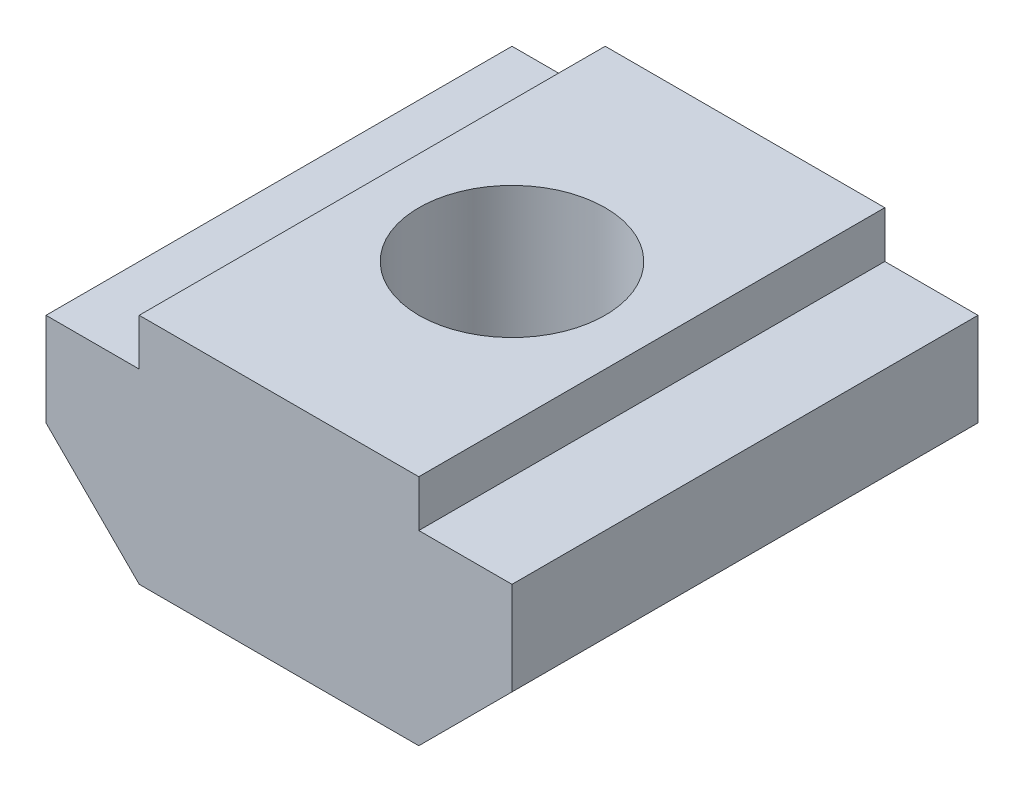
ISO-10303-21;
HEADER;
FILE_DESCRIPTION(('STEP AP214'),'2;1');
FILE_NAME('part.step','',(''),(''),'','','');
FILE_SCHEMA(('AUTOMOTIVE_DESIGN { 1 0 10303 214 1 1 1 1 }'));
ENDSEC;
DATA;
#1=APPLICATION_CONTEXT('core data for automotive mechanical design processes');
#2=APPLICATION_PROTOCOL_DEFINITION('international standard','automotive_design',2000,#1);
#3=PRODUCT_CONTEXT('',#1,'mechanical');
#4=PRODUCT('Part','Part','',(#3));
#5=PRODUCT_RELATED_PRODUCT_CATEGORY('part','',(#4));
#6=PRODUCT_DEFINITION_FORMATION('','',#4);
#7=PRODUCT_DEFINITION_CONTEXT('part definition',#1,'design');
#8=PRODUCT_DEFINITION('design','',#6,#7);
#9=PRODUCT_DEFINITION_SHAPE('','',#8);
#10=(LENGTH_UNIT() NAMED_UNIT(*) SI_UNIT(.MILLI.,.METRE.));
#11=(NAMED_UNIT(*) PLANE_ANGLE_UNIT() SI_UNIT($,.RADIAN.));
#12=(NAMED_UNIT(*) SI_UNIT($,.STERADIAN.) SOLID_ANGLE_UNIT());
#13=UNCERTAINTY_MEASURE_WITH_UNIT(LENGTH_MEASURE(1.E-05),#10,'distance_accuracy_value','');
#14=(GEOMETRIC_REPRESENTATION_CONTEXT(3) GLOBAL_UNCERTAINTY_ASSIGNED_CONTEXT((#13)) GLOBAL_UNIT_ASSIGNED_CONTEXT((#10,
#11,#12)) REPRESENTATION_CONTEXT('',''));
#15=CARTESIAN_POINT('',(0.,0.,0.));
#16=DIRECTION('',(0.,0.,1.));
#17=DIRECTION('',(1.,0.,0.));
#18=AXIS2_PLACEMENT_3D('',#15,#16,#17);
#19=CARTESIAN_POINT('',(3.,0.,10.));
#20=DIRECTION('',(-1.,0.,0.));
#21=DIRECTION('',(0.,0.,1.));
#22=AXIS2_PLACEMENT_3D('',#19,#20,#21);
#23=PLANE('',#22);
#24=DIRECTION('',(0.,1.,0.));
#25=VECTOR('',#24,1.);
#26=CARTESIAN_POINT('',(3.,0.,0.));
#27=LINE('',#26,#25);
#28=CARTESIAN_POINT('',(3.,-0.999999999999999,0.));
#29=VERTEX_POINT('',#28);
#30=CARTESIAN_POINT('',(3.,0.,0.));
#31=VERTEX_POINT('',#30);
#32=EDGE_CURVE('E136',#29,#31,#27,.T.);
#33=ORIENTED_EDGE('',*,*,#32,.T.);
#34=DIRECTION('',(0.,0.,-1.));
#35=VECTOR('',#34,1.);
#36=CARTESIAN_POINT('',(3.,0.,10.));
#37=LINE('',#36,#35);
#38=CARTESIAN_POINT('',(3.,0.,10.));
#39=VERTEX_POINT('',#38);
#40=EDGE_CURVE('E118',#39,#31,#37,.T.);
#41=ORIENTED_EDGE('',*,*,#40,.F.);
#42=DIRECTION('',(0.,1.,0.));
#43=VECTOR('',#42,1.);
#44=CARTESIAN_POINT('',(3.,0.,10.));
#45=LINE('',#44,#43);
#46=CARTESIAN_POINT('',(3.,-0.999999999999999,10.));
#47=VERTEX_POINT('',#46);
#48=EDGE_CURVE('E124',#47,#39,#45,.T.);
#49=ORIENTED_EDGE('',*,*,#48,.F.);
#50=DIRECTION('',(0.,0.,-1.));
#51=VECTOR('',#50,1.);
#52=CARTESIAN_POINT('',(3.,-0.999999999999999,10.));
#53=LINE('',#52,#51);
#54=EDGE_CURVE('E186',#47,#29,#53,.T.);
#55=ORIENTED_EDGE('',*,*,#54,.T.);
#56=EDGE_LOOP('',(#33,#41,#49,#55));
#57=FACE_BOUND('',#56,.T.);
#58=ADVANCED_FACE('F34',(#57),#23,.F.);
#59=CARTESIAN_POINT('',(-3.,0.,10.));
#60=DIRECTION('',(0.,-1.,0.));
#61=DIRECTION('',(0.,0.,-1.));
#62=AXIS2_PLACEMENT_3D('',#59,#60,#61);
#63=PLANE('',#62);
#64=CARTESIAN_POINT('',(0.,0.,5.));
#65=DIRECTION('',(0.,1.,0.));
#66=DIRECTION('',(0.,0.,1.));
#67=AXIS2_PLACEMENT_3D('',#64,#65,#66);
#68=CIRCLE('',#67,2.);
#69=CARTESIAN_POINT('',(0.,0.,7.));
#70=VERTEX_POINT('',#69);
#71=EDGE_CURVE('E211',#70,#70,#68,.T.);
#72=ORIENTED_EDGE('',*,*,#71,.F.);
#73=EDGE_LOOP('',(#72));
#74=FACE_BOUND('',#73,.T.);
#75=DIRECTION('',(-1.,0.,0.));
#76=VECTOR('',#75,1.);
#77=CARTESIAN_POINT('',(-3.,0.,0.));
#78=LINE('',#77,#76);
#79=CARTESIAN_POINT('',(-3.,0.,0.));
#80=VERTEX_POINT('',#79);
#81=EDGE_CURVE('E199',#31,#80,#78,.T.);
#82=ORIENTED_EDGE('',*,*,#81,.T.);
#83=DIRECTION('',(0.,0.,-1.));
#84=VECTOR('',#83,1.);
#85=CARTESIAN_POINT('',(-3.,0.,10.));
#86=LINE('',#85,#84);
#87=CARTESIAN_POINT('',(-3.,0.,10.));
#88=VERTEX_POINT('',#87);
#89=EDGE_CURVE('E121',#88,#80,#86,.T.);
#90=ORIENTED_EDGE('',*,*,#89,.F.);
#91=DIRECTION('',(-1.,0.,0.));
#92=VECTOR('',#91,1.);
#93=CARTESIAN_POINT('',(-3.,0.,10.));
#94=LINE('',#93,#92);
#95=EDGE_CURVE('E114',#39,#88,#94,.T.);
#96=ORIENTED_EDGE('',*,*,#95,.F.);
#97=ORIENTED_EDGE('',*,*,#40,.T.);
#98=EDGE_LOOP('',(#82,#90,#96,#97));
#99=FACE_BOUND('',#98,.T.);
#100=ADVANCED_FACE('F116',(#74,#99),#63,.F.);
#101=CARTESIAN_POINT('',(-3.,0.,10.));
#102=DIRECTION('',(1.,0.,0.));
#103=DIRECTION('',(0.,0.,-1.));
#104=AXIS2_PLACEMENT_3D('',#101,#102,#103);
#105=PLANE('',#104);
#106=DIRECTION('',(0.,-1.,0.));
#107=VECTOR('',#106,1.);
#108=CARTESIAN_POINT('',(-3.,0.,0.));
#109=LINE('',#108,#107);
#110=CARTESIAN_POINT('',(-3.,-1.,0.));
#111=VERTEX_POINT('',#110);
#112=EDGE_CURVE('E180',#80,#111,#109,.T.);
#113=ORIENTED_EDGE('',*,*,#112,.T.);
#114=DIRECTION('',(0.,0.,-1.));
#115=VECTOR('',#114,1.);
#116=CARTESIAN_POINT('',(-3.,-1.,10.));
#117=LINE('',#116,#115);
#118=CARTESIAN_POINT('',(-3.,-1.,10.));
#119=VERTEX_POINT('',#118);
#120=EDGE_CURVE('E141',#119,#111,#117,.T.);
#121=ORIENTED_EDGE('',*,*,#120,.F.);
#122=DIRECTION('',(0.,-1.,0.));
#123=VECTOR('',#122,1.);
#124=CARTESIAN_POINT('',(-3.,0.,10.));
#125=LINE('',#124,#123);
#126=EDGE_CURVE('E123',#88,#119,#125,.T.);
#127=ORIENTED_EDGE('',*,*,#126,.F.);
#128=ORIENTED_EDGE('',*,*,#89,.T.);
#129=EDGE_LOOP('',(#113,#121,#127,#128));
#130=FACE_BOUND('',#129,.T.);
#131=ADVANCED_FACE('F218',(#130),#105,.F.);
#132=CARTESIAN_POINT('',(-5.,-1.,10.));
#133=DIRECTION('',(0.,-1.,0.));
#134=DIRECTION('',(1.,0.,0.));
#135=AXIS2_PLACEMENT_3D('',#132,#133,#134);
#136=PLANE('',#135);
#137=DIRECTION('',(-1.,0.,0.));
#138=VECTOR('',#137,1.);
#139=CARTESIAN_POINT('',(-5.,-1.,0.));
#140=LINE('',#139,#138);
#141=CARTESIAN_POINT('',(-5.,-1.,0.));
#142=VERTEX_POINT('',#141);
#143=EDGE_CURVE('E176',#111,#142,#140,.T.);
#144=ORIENTED_EDGE('',*,*,#143,.T.);
#145=DIRECTION('',(0.,0.,-1.));
#146=VECTOR('',#145,1.);
#147=CARTESIAN_POINT('',(-5.,-1.,10.));
#148=LINE('',#147,#146);
#149=CARTESIAN_POINT('',(-5.,-1.,10.));
#150=VERTEX_POINT('',#149);
#151=EDGE_CURVE('E175',#150,#142,#148,.T.);
#152=ORIENTED_EDGE('',*,*,#151,.F.);
#153=DIRECTION('',(-1.,0.,0.));
#154=VECTOR('',#153,1.);
#155=CARTESIAN_POINT('',(-5.,-1.,10.));
#156=LINE('',#155,#154);
#157=EDGE_CURVE('E196',#119,#150,#156,.T.);
#158=ORIENTED_EDGE('',*,*,#157,.F.);
#159=ORIENTED_EDGE('',*,*,#120,.T.);
#160=EDGE_LOOP('',(#144,#152,#158,#159));
#161=FACE_BOUND('',#160,.T.);
#162=ADVANCED_FACE('F195',(#161),#136,.F.);
#163=CARTESIAN_POINT('',(-5.,-1.,10.));
#164=DIRECTION('',(1.,0.,0.));
#165=DIRECTION('',(0.,1.,0.));
#166=AXIS2_PLACEMENT_3D('',#163,#164,#165);
#167=PLANE('',#166);
#168=DIRECTION('',(0.,-1.,0.));
#169=VECTOR('',#168,1.);
#170=CARTESIAN_POINT('',(-5.,-1.,0.));
#171=LINE('',#170,#169);
#172=CARTESIAN_POINT('',(-5.,-2.99999999999999,0.));
#173=VERTEX_POINT('',#172);
#174=EDGE_CURVE('E170',#142,#173,#171,.T.);
#175=ORIENTED_EDGE('',*,*,#174,.T.);
#176=DIRECTION('',(0.,0.,1.));
#177=VECTOR('',#176,1.);
#178=CARTESIAN_POINT('',(-5.,-2.99999999999999,10.));
#179=LINE('',#178,#177);
#180=CARTESIAN_POINT('',(-5.,-2.99999999999999,10.));
#181=VERTEX_POINT('',#180);
#182=EDGE_CURVE('E57',#173,#181,#179,.T.);
#183=ORIENTED_EDGE('',*,*,#182,.T.);
#184=DIRECTION('',(0.,-1.,0.));
#185=VECTOR('',#184,1.);
#186=CARTESIAN_POINT('',(-5.,-1.,10.));
#187=LINE('',#186,#185);
#188=EDGE_CURVE('E155',#150,#181,#187,.T.);
#189=ORIENTED_EDGE('',*,*,#188,.F.);
#190=ORIENTED_EDGE('',*,*,#151,.T.);
#191=EDGE_LOOP('',(#175,#183,#189,#190));
#192=FACE_BOUND('',#191,.T.);
#193=ADVANCED_FACE('F173',(#192),#167,.F.);
#194=CARTESIAN_POINT('',(-5.,-5.,10.));
#195=DIRECTION('',(0.,1.,0.));
#196=DIRECTION('',(0.,0.,1.));
#197=AXIS2_PLACEMENT_3D('',#194,#195,#196);
#198=PLANE('',#197);
#199=CARTESIAN_POINT('',(0.,-5.,5.));
#200=DIRECTION('',(0.,1.,0.));
#201=DIRECTION('',(0.,0.,1.));
#202=AXIS2_PLACEMENT_3D('',#199,#200,#201);
#203=CIRCLE('',#202,2.);
#204=CARTESIAN_POINT('',(0.,-5.,7.));
#205=VERTEX_POINT('',#204);
#206=EDGE_CURVE('E203',#205,#205,#203,.F.);
#207=ORIENTED_EDGE('',*,*,#206,.F.);
#208=EDGE_LOOP('',(#207));
#209=FACE_BOUND('',#208,.T.);
#210=DIRECTION('',(1.,0.,0.));
#211=VECTOR('',#210,1.);
#212=CARTESIAN_POINT('',(-5.,-5.,10.));
#213=LINE('',#212,#211);
#214=CARTESIAN_POINT('',(-3.,-5.,10.));
#215=VERTEX_POINT('',#214);
#216=CARTESIAN_POINT('',(2.99999999999999,-5.,10.));
#217=VERTEX_POINT('',#216);
#218=EDGE_CURVE('E154',#215,#217,#213,.T.);
#219=ORIENTED_EDGE('',*,*,#218,.F.);
#220=DIRECTION('',(0.,0.,-1.));
#221=VECTOR('',#220,1.);
#222=CARTESIAN_POINT('',(-3.,-5.,10.));
#223=LINE('',#222,#221);
#224=CARTESIAN_POINT('',(-3.,-5.,0.));
#225=VERTEX_POINT('',#224);
#226=EDGE_CURVE('E139',#215,#225,#223,.T.);
#227=ORIENTED_EDGE('',*,*,#226,.T.);
#228=DIRECTION('',(1.,0.,0.));
#229=VECTOR('',#228,1.);
#230=CARTESIAN_POINT('',(-5.,-5.,0.));
#231=LINE('',#230,#229);
#232=CARTESIAN_POINT('',(2.99999999999999,-5.,0.));
#233=VERTEX_POINT('',#232);
#234=EDGE_CURVE('E171',#225,#233,#231,.T.);
#235=ORIENTED_EDGE('',*,*,#234,.T.);
#236=DIRECTION('',(0.,0.,1.));
#237=VECTOR('',#236,1.);
#238=CARTESIAN_POINT('',(2.99999999999999,-5.,10.));
#239=LINE('',#238,#237);
#240=EDGE_CURVE('E137',#233,#217,#239,.T.);
#241=ORIENTED_EDGE('',*,*,#240,.T.);
#242=EDGE_LOOP('',(#219,#227,#235,#241));
#243=FACE_BOUND('',#242,.T.);
#244=ADVANCED_FACE('F159',(#209,#243),#198,.F.);
#245=CARTESIAN_POINT('',(5.,-5.,10.));
#246=DIRECTION('',(-1.,0.,0.));
#247=DIRECTION('',(0.,-1.,0.));
#248=AXIS2_PLACEMENT_3D('',#245,#246,#247);
#249=PLANE('',#248);
#250=DIRECTION('',(0.,1.,0.));
#251=VECTOR('',#250,1.);
#252=CARTESIAN_POINT('',(5.,-5.,10.));
#253=LINE('',#252,#251);
#254=CARTESIAN_POINT('',(5.,-3.,10.));
#255=VERTEX_POINT('',#254);
#256=CARTESIAN_POINT('',(5.,-0.999999999999998,10.));
#257=VERTEX_POINT('',#256);
#258=EDGE_CURVE('E163',#255,#257,#253,.T.);
#259=ORIENTED_EDGE('',*,*,#258,.F.);
#260=DIRECTION('',(0.,0.,-1.));
#261=VECTOR('',#260,1.);
#262=CARTESIAN_POINT('',(5.,-3.,10.));
#263=LINE('',#262,#261);
#264=CARTESIAN_POINT('',(5.,-3.,0.));
#265=VERTEX_POINT('',#264);
#266=EDGE_CURVE('E11',#255,#265,#263,.T.);
#267=ORIENTED_EDGE('',*,*,#266,.T.);
#268=DIRECTION('',(0.,1.,0.));
#269=VECTOR('',#268,1.);
#270=CARTESIAN_POINT('',(5.,-5.,0.));
#271=LINE('',#270,#269);
#272=CARTESIAN_POINT('',(5.,-0.999999999999998,0.));
#273=VERTEX_POINT('',#272);
#274=EDGE_CURVE('E178',#265,#273,#271,.T.);
#275=ORIENTED_EDGE('',*,*,#274,.T.);
#276=DIRECTION('',(0.,0.,-1.));
#277=VECTOR('',#276,1.);
#278=CARTESIAN_POINT('',(5.,-0.999999999999998,10.));
#279=LINE('',#278,#277);
#280=EDGE_CURVE('E188',#257,#273,#279,.T.);
#281=ORIENTED_EDGE('',*,*,#280,.F.);
#282=EDGE_LOOP('',(#259,#267,#275,#281));
#283=FACE_BOUND('',#282,.T.);
#284=ADVANCED_FACE('F243',(#283),#249,.F.);
#285=CARTESIAN_POINT('',(3.,-0.999999999999999,10.));
#286=DIRECTION('',(0.,-1.,0.));
#287=DIRECTION('',(1.,0.,0.));
#288=AXIS2_PLACEMENT_3D('',#285,#286,#287);
#289=PLANE('',#288);
#290=DIRECTION('',(-1.,0.,0.));
#291=VECTOR('',#290,1.);
#292=CARTESIAN_POINT('',(3.,-0.999999999999999,0.));
#293=LINE('',#292,#291);
#294=EDGE_CURVE('E133',#273,#29,#293,.T.);
#295=ORIENTED_EDGE('',*,*,#294,.T.);
#296=ORIENTED_EDGE('',*,*,#54,.F.);
#297=DIRECTION('',(-1.,0.,0.));
#298=VECTOR('',#297,1.);
#299=CARTESIAN_POINT('',(3.,-0.999999999999999,10.));
#300=LINE('',#299,#298);
#301=EDGE_CURVE('E129',#257,#47,#300,.T.);
#302=ORIENTED_EDGE('',*,*,#301,.F.);
#303=ORIENTED_EDGE('',*,*,#280,.T.);
#304=EDGE_LOOP('',(#295,#296,#302,#303));
#305=FACE_BOUND('',#304,.T.);
#306=ADVANCED_FACE('F237',(#305),#289,.F.);
#307=CARTESIAN_POINT('',(0.,0.,10.));
#308=DIRECTION('',(0.,0.,1.));
#309=DIRECTION('',(1.,0.,0.));
#310=AXIS2_PLACEMENT_3D('',#307,#308,#309);
#311=PLANE('',#310);
#312=ORIENTED_EDGE('',*,*,#188,.T.);
#313=DIRECTION('',(-0.707106781186546,0.707106781186549,0.));
#314=VECTOR('',#313,1.);
#315=CARTESIAN_POINT('',(-4.,-3.99999999999999,10.));
#316=LINE('',#315,#314);
#317=EDGE_CURVE('E42',#181,#215,#316,.F.);
#318=ORIENTED_EDGE('',*,*,#317,.T.);
#319=ORIENTED_EDGE('',*,*,#218,.T.);
#320=DIRECTION('',(-0.707106781186549,-0.707106781186546,0.));
#321=VECTOR('',#320,1.);
#322=CARTESIAN_POINT('',(3.99999999999999,-4.,10.));
#323=LINE('',#322,#321);
#324=EDGE_CURVE('E49',#217,#255,#323,.F.);
#325=ORIENTED_EDGE('',*,*,#324,.T.);
#326=ORIENTED_EDGE('',*,*,#258,.T.);
#327=ORIENTED_EDGE('',*,*,#301,.T.);
#328=ORIENTED_EDGE('',*,*,#48,.T.);
#329=ORIENTED_EDGE('',*,*,#95,.T.);
#330=ORIENTED_EDGE('',*,*,#126,.T.);
#331=ORIENTED_EDGE('',*,*,#157,.T.);
#332=EDGE_LOOP('',(#312,#318,#319,#325,#326,#327,#328,#329,#330,#331));
#333=FACE_BOUND('',#332,.T.);
#334=ADVANCED_FACE('F127',(#333),#311,.T.);
#335=CARTESIAN_POINT('',(0.,0.,0.));
#336=DIRECTION('',(0.,0.,1.));
#337=DIRECTION('',(1.,0.,0.));
#338=AXIS2_PLACEMENT_3D('',#335,#336,#337);
#339=PLANE('',#338);
#340=ORIENTED_EDGE('',*,*,#234,.F.);
#341=DIRECTION('',(0.707106781186546,-0.707106781186549,0.));
#342=VECTOR('',#341,1.);
#343=CARTESIAN_POINT('',(-3.,-5.,0.));
#344=LINE('',#343,#342);
#345=EDGE_CURVE('E149',#225,#173,#344,.F.);
#346=ORIENTED_EDGE('',*,*,#345,.T.);
#347=ORIENTED_EDGE('',*,*,#174,.F.);
#348=ORIENTED_EDGE('',*,*,#143,.F.);
#349=ORIENTED_EDGE('',*,*,#112,.F.);
#350=ORIENTED_EDGE('',*,*,#81,.F.);
#351=ORIENTED_EDGE('',*,*,#32,.F.);
#352=ORIENTED_EDGE('',*,*,#294,.F.);
#353=ORIENTED_EDGE('',*,*,#274,.F.);
#354=DIRECTION('',(0.707106781186549,0.707106781186546,0.));
#355=VECTOR('',#354,1.);
#356=CARTESIAN_POINT('',(5.,-3.,0.));
#357=LINE('',#356,#355);
#358=EDGE_CURVE('E147',#265,#233,#357,.F.);
#359=ORIENTED_EDGE('',*,*,#358,.T.);
#360=EDGE_LOOP('',(#340,#346,#347,#348,#349,#350,#351,#352,#353,#359));
#361=FACE_BOUND('',#360,.T.);
#362=ADVANCED_FACE('F168',(#361),#339,.F.);
#363=CARTESIAN_POINT('',(-3.,-5.,10.));
#364=DIRECTION('',(0.707106781186549,0.707106781186546,0.));
#365=DIRECTION('',(0.,0.,-1.));
#366=AXIS2_PLACEMENT_3D('',#363,#364,#365);
#367=PLANE('',#366);
#368=ORIENTED_EDGE('',*,*,#317,.F.);
#369=ORIENTED_EDGE('',*,*,#182,.F.);
#370=ORIENTED_EDGE('',*,*,#345,.F.);
#371=ORIENTED_EDGE('',*,*,#226,.F.);
#372=EDGE_LOOP('',(#368,#369,#370,#371));
#373=FACE_BOUND('',#372,.T.);
#374=ADVANCED_FACE('F165',(#373),#367,.F.);
#375=CARTESIAN_POINT('',(5.,-3.,10.));
#376=DIRECTION('',(-0.707106781186546,0.707106781186549,0.));
#377=DIRECTION('',(0.,0.,-1.));
#378=AXIS2_PLACEMENT_3D('',#375,#376,#377);
#379=PLANE('',#378);
#380=ORIENTED_EDGE('',*,*,#324,.F.);
#381=ORIENTED_EDGE('',*,*,#240,.F.);
#382=ORIENTED_EDGE('',*,*,#358,.F.);
#383=ORIENTED_EDGE('',*,*,#266,.F.);
#384=EDGE_LOOP('',(#380,#381,#382,#383));
#385=FACE_BOUND('',#384,.T.);
#386=ADVANCED_FACE('F36',(#385),#379,.F.);
#387=CARTESIAN_POINT('',(0.,-10.6568542494924,5.));
#388=DIRECTION('',(0.,1.,0.));
#389=DIRECTION('',(0.,0.,1.));
#390=AXIS2_PLACEMENT_3D('',#387,#388,#389);
#391=CYLINDRICAL_SURFACE('',#390,2.);
#392=ORIENTED_EDGE('',*,*,#206,.T.);
#393=EDGE_LOOP('',(#392));
#394=FACE_BOUND('',#393,.T.);
#395=ORIENTED_EDGE('',*,*,#71,.T.);
#396=EDGE_LOOP('',(#395));
#397=FACE_BOUND('',#396,.T.);
#398=ADVANCED_FACE('F215',(#394,#397),#391,.F.);
#399=CLOSED_SHELL('',(#58,#100,#131,#162,#193,#244,#284,#306,#334,#362,#374,#386,#398));
#400=MANIFOLD_SOLID_BREP('B2',#399);
#401=ADVANCED_BREP_SHAPE_REPRESENTATION('',(#18,#400),#14);
#402=SHAPE_DEFINITION_REPRESENTATION(#9,#401);
ENDSEC;
END-ISO-10303-21;
